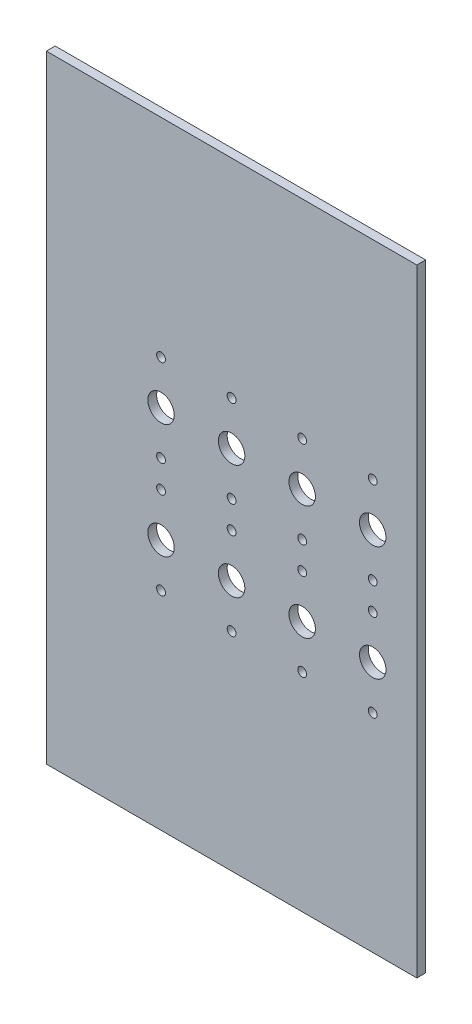
ISO-10303-21;
HEADER;
FILE_DESCRIPTION(('STEP AP214'),'2;1');
FILE_NAME('part.step','',(''),(''),'','','');
FILE_SCHEMA(('AUTOMOTIVE_DESIGN { 1 0 10303 214 1 1 1 1 }'));
ENDSEC;
DATA;
#1=APPLICATION_CONTEXT('core data for automotive mechanical design processes');
#2=APPLICATION_PROTOCOL_DEFINITION('international standard','automotive_design',2000,#1);
#3=PRODUCT_CONTEXT('',#1,'mechanical');
#4=PRODUCT('Part','Part','',(#3));
#5=PRODUCT_RELATED_PRODUCT_CATEGORY('part','',(#4));
#6=PRODUCT_DEFINITION_FORMATION('','',#4);
#7=PRODUCT_DEFINITION_CONTEXT('part definition',#1,'design');
#8=PRODUCT_DEFINITION('design','',#6,#7);
#9=PRODUCT_DEFINITION_SHAPE('','',#8);
#10=(LENGTH_UNIT() NAMED_UNIT(*) SI_UNIT(.MILLI.,.METRE.));
#11=(NAMED_UNIT(*) PLANE_ANGLE_UNIT() SI_UNIT($,.RADIAN.));
#12=(NAMED_UNIT(*) SI_UNIT($,.STERADIAN.) SOLID_ANGLE_UNIT());
#13=UNCERTAINTY_MEASURE_WITH_UNIT(LENGTH_MEASURE(1.E-05),#10,'distance_accuracy_value','');
#14=(GEOMETRIC_REPRESENTATION_CONTEXT(3) GLOBAL_UNCERTAINTY_ASSIGNED_CONTEXT((#13)) GLOBAL_UNIT_ASSIGNED_CONTEXT((#10,
#11,#12)) REPRESENTATION_CONTEXT('',''));
#15=CARTESIAN_POINT('',(0.,0.,0.));
#16=DIRECTION('',(0.,0.,1.));
#17=DIRECTION('',(1.,0.,0.));
#18=AXIS2_PLACEMENT_3D('',#15,#16,#17);
#19=CARTESIAN_POINT('',(0.,0.,10.));
#20=DIRECTION('',(0.,0.,1.));
#21=DIRECTION('',(1.,0.,0.));
#22=AXIS2_PLACEMENT_3D('',#19,#20,#21);
#23=PLANE('',#22);
#24=CARTESIAN_POINT('',(290.,-65.,10.));
#25=DIRECTION('',(0.,0.,1.));
#26=DIRECTION('',(1.,0.,0.));
#27=AXIS2_PLACEMENT_3D('',#24,#25,#26);
#28=CIRCLE('',#27,15.);
#29=CARTESIAN_POINT('',(305.,-65.,10.));
#30=VERTEX_POINT('',#29);
#31=EDGE_CURVE('E221',#30,#30,#28,.T.);
#32=ORIENTED_EDGE('',*,*,#31,.F.);
#33=EDGE_LOOP('',(#32));
#34=FACE_BOUND('',#33,.T.);
#35=CARTESIAN_POINT('',(130.,-65.,10.));
#36=DIRECTION('',(0.,0.,1.));
#37=DIRECTION('',(1.,0.,0.));
#38=AXIS2_PLACEMENT_3D('',#35,#36,#37);
#39=CIRCLE('',#38,15.);
#40=CARTESIAN_POINT('',(145.,-65.,10.));
#41=VERTEX_POINT('',#40);
#42=EDGE_CURVE('E215',#41,#41,#39,.T.);
#43=ORIENTED_EDGE('',*,*,#42,.F.);
#44=EDGE_LOOP('',(#43));
#45=FACE_BOUND('',#44,.T.);
#46=CARTESIAN_POINT('',(370.,-114.5,10.));
#47=DIRECTION('',(0.,0.,1.));
#48=DIRECTION('',(1.,0.,0.));
#49=AXIS2_PLACEMENT_3D('',#46,#47,#48);
#50=CIRCLE('',#49,4.99999999999989);
#51=CARTESIAN_POINT('',(375.,-114.5,10.));
#52=VERTEX_POINT('',#51);
#53=EDGE_CURVE('E199',#52,#52,#50,.T.);
#54=ORIENTED_EDGE('',*,*,#53,.F.);
#55=EDGE_LOOP('',(#54));
#56=FACE_BOUND('',#55,.T.);
#57=CARTESIAN_POINT('',(290.,-114.5,10.));
#58=DIRECTION('',(0.,0.,1.));
#59=DIRECTION('',(1.,0.,0.));
#60=AXIS2_PLACEMENT_3D('',#57,#58,#59);
#61=CIRCLE('',#60,4.99999999999989);
#62=CARTESIAN_POINT('',(295.,-114.5,10.));
#63=VERTEX_POINT('',#62);
#64=EDGE_CURVE('E187',#63,#63,#61,.T.);
#65=ORIENTED_EDGE('',*,*,#64,.F.);
#66=EDGE_LOOP('',(#65));
#67=FACE_BOUND('',#66,.T.);
#68=CARTESIAN_POINT('',(210.,-114.5,10.));
#69=DIRECTION('',(0.,0.,1.));
#70=DIRECTION('',(1.,0.,0.));
#71=AXIS2_PLACEMENT_3D('',#68,#69,#70);
#72=CIRCLE('',#71,4.99999999999989);
#73=CARTESIAN_POINT('',(215.,-114.5,10.));
#74=VERTEX_POINT('',#73);
#75=EDGE_CURVE('E176',#74,#74,#72,.T.);
#76=ORIENTED_EDGE('',*,*,#75,.F.);
#77=EDGE_LOOP('',(#76));
#78=FACE_BOUND('',#77,.T.);
#79=CARTESIAN_POINT('',(130.,-114.5,10.));
#80=DIRECTION('',(0.,0.,1.));
#81=DIRECTION('',(1.,0.,0.));
#82=AXIS2_PLACEMENT_3D('',#79,#80,#81);
#83=CIRCLE('',#82,4.99999999999989);
#84=CARTESIAN_POINT('',(135.,-114.5,10.));
#85=VERTEX_POINT('',#84);
#86=EDGE_CURVE('E163',#85,#85,#83,.T.);
#87=ORIENTED_EDGE('',*,*,#86,.F.);
#88=EDGE_LOOP('',(#87));
#89=FACE_BOUND('',#88,.T.);
#90=CARTESIAN_POINT('',(290.,65.,10.));
#91=DIRECTION('',(0.,0.,1.));
#92=DIRECTION('',(1.,0.,0.));
#93=AXIS2_PLACEMENT_3D('',#90,#91,#92);
#94=CIRCLE('',#93,15.);
#95=CARTESIAN_POINT('',(305.,65.,10.));
#96=VERTEX_POINT('',#95);
#97=EDGE_CURVE('E155',#96,#96,#94,.T.);
#98=ORIENTED_EDGE('',*,*,#97,.F.);
#99=EDGE_LOOP('',(#98));
#100=FACE_BOUND('',#99,.T.);
#101=CARTESIAN_POINT('',(130.,65.,10.));
#102=DIRECTION('',(0.,0.,1.));
#103=DIRECTION('',(1.,0.,0.));
#104=AXIS2_PLACEMENT_3D('',#101,#102,#103);
#105=CIRCLE('',#104,15.);
#106=CARTESIAN_POINT('',(145.,65.,10.));
#107=VERTEX_POINT('',#106);
#108=EDGE_CURVE('E139',#107,#107,#105,.T.);
#109=ORIENTED_EDGE('',*,*,#108,.F.);
#110=EDGE_LOOP('',(#109));
#111=FACE_BOUND('',#110,.T.);
#112=CARTESIAN_POINT('',(370.,114.5,10.));
#113=DIRECTION('',(0.,0.,1.));
#114=DIRECTION('',(1.,0.,0.));
#115=AXIS2_PLACEMENT_3D('',#112,#113,#114);
#116=CIRCLE('',#115,4.99999999999989);
#117=CARTESIAN_POINT('',(375.,114.5,10.));
#118=VERTEX_POINT('',#117);
#119=EDGE_CURVE('E128',#118,#118,#116,.T.);
#120=ORIENTED_EDGE('',*,*,#119,.F.);
#121=EDGE_LOOP('',(#120));
#122=FACE_BOUND('',#121,.T.);
#123=CARTESIAN_POINT('',(290.,114.5,10.));
#124=DIRECTION('',(0.,0.,1.));
#125=DIRECTION('',(1.,0.,0.));
#126=AXIS2_PLACEMENT_3D('',#123,#124,#125);
#127=CIRCLE('',#126,4.99999999999989);
#128=CARTESIAN_POINT('',(295.,114.5,10.));
#129=VERTEX_POINT('',#128);
#130=EDGE_CURVE('E116',#129,#129,#127,.T.);
#131=ORIENTED_EDGE('',*,*,#130,.F.);
#132=EDGE_LOOP('',(#131));
#133=FACE_BOUND('',#132,.T.);
#134=CARTESIAN_POINT('',(210.,114.5,10.));
#135=DIRECTION('',(0.,0.,1.));
#136=DIRECTION('',(1.,0.,0.));
#137=AXIS2_PLACEMENT_3D('',#134,#135,#136);
#138=CIRCLE('',#137,4.99999999999989);
#139=CARTESIAN_POINT('',(215.,114.5,10.));
#140=VERTEX_POINT('',#139);
#141=EDGE_CURVE('E102',#140,#140,#138,.T.);
#142=ORIENTED_EDGE('',*,*,#141,.F.);
#143=EDGE_LOOP('',(#142));
#144=FACE_BOUND('',#143,.T.);
#145=CARTESIAN_POINT('',(130.,114.5,10.));
#146=DIRECTION('',(0.,0.,1.));
#147=DIRECTION('',(1.,0.,0.));
#148=AXIS2_PLACEMENT_3D('',#145,#146,#147);
#149=CIRCLE('',#148,4.99999999999989);
#150=CARTESIAN_POINT('',(135.,114.5,10.));
#151=VERTEX_POINT('',#150);
#152=EDGE_CURVE('E83',#151,#151,#149,.T.);
#153=ORIENTED_EDGE('',*,*,#152,.F.);
#154=EDGE_LOOP('',(#153));
#155=FACE_BOUND('',#154,.T.);
#156=DIRECTION('',(0.,-1.,0.));
#157=VECTOR('',#156,1.);
#158=CARTESIAN_POINT('',(0.,350.,10.));
#159=LINE('',#158,#157);
#160=CARTESIAN_POINT('',(0.,350.,10.));
#161=VERTEX_POINT('',#160);
#162=CARTESIAN_POINT('',(0.,-350.,10.));
#163=VERTEX_POINT('',#162);
#164=EDGE_CURVE('E68',#161,#163,#159,.T.);
#165=ORIENTED_EDGE('',*,*,#164,.T.);
#166=DIRECTION('',(1.,0.,0.));
#167=VECTOR('',#166,1.);
#168=CARTESIAN_POINT('',(0.,-350.,10.));
#169=LINE('',#168,#167);
#170=CARTESIAN_POINT('',(420.,-350.,10.));
#171=VERTEX_POINT('',#170);
#172=EDGE_CURVE('E64',#163,#171,#169,.T.);
#173=ORIENTED_EDGE('',*,*,#172,.T.);
#174=DIRECTION('',(0.,1.,0.));
#175=VECTOR('',#174,1.);
#176=CARTESIAN_POINT('',(420.,-350.,10.));
#177=LINE('',#176,#175);
#178=CARTESIAN_POINT('',(420.,350.,10.));
#179=VERTEX_POINT('',#178);
#180=EDGE_CURVE('E66',#171,#179,#177,.T.);
#181=ORIENTED_EDGE('',*,*,#180,.T.);
#182=DIRECTION('',(-1.,0.,0.));
#183=VECTOR('',#182,1.);
#184=CARTESIAN_POINT('',(420.,350.,10.));
#185=LINE('',#184,#183);
#186=EDGE_CURVE('E31',#179,#161,#185,.T.);
#187=ORIENTED_EDGE('',*,*,#186,.T.);
#188=EDGE_LOOP('',(#165,#173,#181,#187));
#189=FACE_BOUND('',#188,.T.);
#190=CARTESIAN_POINT('',(130.,15.5,10.));
#191=DIRECTION('',(0.,0.,1.));
#192=DIRECTION('',(1.,0.,0.));
#193=AXIS2_PLACEMENT_3D('',#190,#191,#192);
#194=CIRCLE('',#193,4.99999999999989);
#195=CARTESIAN_POINT('',(135.,15.5,10.));
#196=VERTEX_POINT('',#195);
#197=EDGE_CURVE('E98',#196,#196,#194,.T.);
#198=ORIENTED_EDGE('',*,*,#197,.F.);
#199=EDGE_LOOP('',(#198));
#200=FACE_BOUND('',#199,.T.);
#201=CARTESIAN_POINT('',(210.,15.5,10.));
#202=DIRECTION('',(0.,0.,1.));
#203=DIRECTION('',(1.,0.,0.));
#204=AXIS2_PLACEMENT_3D('',#201,#202,#203);
#205=CIRCLE('',#204,4.99999999999989);
#206=CARTESIAN_POINT('',(215.,15.5,10.));
#207=VERTEX_POINT('',#206);
#208=EDGE_CURVE('E109',#207,#207,#205,.T.);
#209=ORIENTED_EDGE('',*,*,#208,.F.);
#210=EDGE_LOOP('',(#209));
#211=FACE_BOUND('',#210,.T.);
#212=CARTESIAN_POINT('',(290.,15.5,10.));
#213=DIRECTION('',(0.,0.,1.));
#214=DIRECTION('',(1.,0.,0.));
#215=AXIS2_PLACEMENT_3D('',#212,#213,#214);
#216=CIRCLE('',#215,4.99999999999989);
#217=CARTESIAN_POINT('',(295.,15.5,10.));
#218=VERTEX_POINT('',#217);
#219=EDGE_CURVE('E125',#218,#218,#216,.T.);
#220=ORIENTED_EDGE('',*,*,#219,.F.);
#221=EDGE_LOOP('',(#220));
#222=FACE_BOUND('',#221,.T.);
#223=CARTESIAN_POINT('',(370.,15.5,10.));
#224=DIRECTION('',(0.,0.,1.));
#225=DIRECTION('',(1.,0.,0.));
#226=AXIS2_PLACEMENT_3D('',#223,#224,#225);
#227=CIRCLE('',#226,4.99999999999989);
#228=CARTESIAN_POINT('',(375.,15.5,10.));
#229=VERTEX_POINT('',#228);
#230=EDGE_CURVE('E133',#229,#229,#227,.T.);
#231=ORIENTED_EDGE('',*,*,#230,.F.);
#232=EDGE_LOOP('',(#231));
#233=FACE_BOUND('',#232,.T.);
#234=CARTESIAN_POINT('',(210.,65.,10.));
#235=DIRECTION('',(0.,0.,1.));
#236=DIRECTION('',(1.,0.,0.));
#237=AXIS2_PLACEMENT_3D('',#234,#235,#236);
#238=CIRCLE('',#237,15.);
#239=CARTESIAN_POINT('',(225.,65.,10.));
#240=VERTEX_POINT('',#239);
#241=EDGE_CURVE('E148',#240,#240,#238,.T.);
#242=ORIENTED_EDGE('',*,*,#241,.F.);
#243=EDGE_LOOP('',(#242));
#244=FACE_BOUND('',#243,.T.);
#245=CARTESIAN_POINT('',(370.,65.,10.));
#246=DIRECTION('',(0.,0.,1.));
#247=DIRECTION('',(1.,0.,0.));
#248=AXIS2_PLACEMENT_3D('',#245,#246,#247);
#249=CIRCLE('',#248,15.);
#250=CARTESIAN_POINT('',(385.,65.,10.));
#251=VERTEX_POINT('',#250);
#252=EDGE_CURVE('E158',#251,#251,#249,.T.);
#253=ORIENTED_EDGE('',*,*,#252,.F.);
#254=EDGE_LOOP('',(#253));
#255=FACE_BOUND('',#254,.T.);
#256=CARTESIAN_POINT('',(130.,-15.5,10.));
#257=DIRECTION('',(0.,0.,1.));
#258=DIRECTION('',(1.,0.,0.));
#259=AXIS2_PLACEMENT_3D('',#256,#257,#258);
#260=CIRCLE('',#259,4.99999999999989);
#261=CARTESIAN_POINT('',(135.,-15.5,10.));
#262=VERTEX_POINT('',#261);
#263=EDGE_CURVE('E168',#262,#262,#260,.T.);
#264=ORIENTED_EDGE('',*,*,#263,.F.);
#265=EDGE_LOOP('',(#264));
#266=FACE_BOUND('',#265,.T.);
#267=CARTESIAN_POINT('',(210.,-15.5,10.));
#268=DIRECTION('',(0.,0.,1.));
#269=DIRECTION('',(1.,0.,0.));
#270=AXIS2_PLACEMENT_3D('',#267,#268,#269);
#271=CIRCLE('',#270,4.99999999999989);
#272=CARTESIAN_POINT('',(215.,-15.5,10.));
#273=VERTEX_POINT('',#272);
#274=EDGE_CURVE('E181',#273,#273,#271,.T.);
#275=ORIENTED_EDGE('',*,*,#274,.F.);
#276=EDGE_LOOP('',(#275));
#277=FACE_BOUND('',#276,.T.);
#278=CARTESIAN_POINT('',(290.,-15.5,10.));
#279=DIRECTION('',(0.,0.,1.));
#280=DIRECTION('',(1.,0.,0.));
#281=AXIS2_PLACEMENT_3D('',#278,#279,#280);
#282=CIRCLE('',#281,4.99999999999989);
#283=CARTESIAN_POINT('',(295.,-15.5,10.));
#284=VERTEX_POINT('',#283);
#285=EDGE_CURVE('E192',#284,#284,#282,.T.);
#286=ORIENTED_EDGE('',*,*,#285,.F.);
#287=EDGE_LOOP('',(#286));
#288=FACE_BOUND('',#287,.T.);
#289=CARTESIAN_POINT('',(370.,-15.5,10.));
#290=DIRECTION('',(0.,0.,1.));
#291=DIRECTION('',(1.,0.,0.));
#292=AXIS2_PLACEMENT_3D('',#289,#290,#291);
#293=CIRCLE('',#292,4.99999999999989);
#294=CARTESIAN_POINT('',(375.,-15.5,10.));
#295=VERTEX_POINT('',#294);
#296=EDGE_CURVE('E206',#295,#295,#293,.T.);
#297=ORIENTED_EDGE('',*,*,#296,.F.);
#298=EDGE_LOOP('',(#297));
#299=FACE_BOUND('',#298,.T.);
#300=CARTESIAN_POINT('',(210.,-65.,10.));
#301=DIRECTION('',(0.,0.,1.));
#302=DIRECTION('',(1.,0.,0.));
#303=AXIS2_PLACEMENT_3D('',#300,#301,#302);
#304=CIRCLE('',#303,15.);
#305=CARTESIAN_POINT('',(225.,-65.,10.));
#306=VERTEX_POINT('',#305);
#307=EDGE_CURVE('E217',#306,#306,#304,.T.);
#308=ORIENTED_EDGE('',*,*,#307,.F.);
#309=EDGE_LOOP('',(#308));
#310=FACE_BOUND('',#309,.T.);
#311=CARTESIAN_POINT('',(370.,-65.,10.));
#312=DIRECTION('',(0.,0.,1.));
#313=DIRECTION('',(1.,0.,0.));
#314=AXIS2_PLACEMENT_3D('',#311,#312,#313);
#315=CIRCLE('',#314,15.);
#316=CARTESIAN_POINT('',(385.,-65.,10.));
#317=VERTEX_POINT('',#316);
#318=EDGE_CURVE('E230',#317,#317,#315,.T.);
#319=ORIENTED_EDGE('',*,*,#318,.F.);
#320=EDGE_LOOP('',(#319));
#321=FACE_BOUND('',#320,.T.);
#322=ADVANCED_FACE('F16',(#34,#45,#56,#67,#78,#89,#100,#111,#122,#133,#144,#155,#189,#200,#211,
#222,#233,#244,#255,#266,#277,#288,#299,#310,#321),#23,.T.);
#323=CARTESIAN_POINT('',(0.,0.,0.));
#324=DIRECTION('',(0.,0.,1.));
#325=DIRECTION('',(1.,0.,0.));
#326=AXIS2_PLACEMENT_3D('',#323,#324,#325);
#327=PLANE('',#326);
#328=CARTESIAN_POINT('',(290.,-65.,0.));
#329=DIRECTION('',(0.,0.,1.));
#330=DIRECTION('',(1.,0.,0.));
#331=AXIS2_PLACEMENT_3D('',#328,#329,#330);
#332=CIRCLE('',#331,15.);
#333=CARTESIAN_POINT('',(305.,-65.,0.));
#334=VERTEX_POINT('',#333);
#335=EDGE_CURVE('E227',#334,#334,#332,.T.);
#336=ORIENTED_EDGE('',*,*,#335,.T.);
#337=EDGE_LOOP('',(#336));
#338=FACE_BOUND('',#337,.T.);
#339=CARTESIAN_POINT('',(130.,-65.,0.));
#340=DIRECTION('',(0.,0.,1.));
#341=DIRECTION('',(1.,0.,0.));
#342=AXIS2_PLACEMENT_3D('',#339,#340,#341);
#343=CIRCLE('',#342,15.);
#344=CARTESIAN_POINT('',(145.,-65.,0.));
#345=VERTEX_POINT('',#344);
#346=EDGE_CURVE('E214',#345,#345,#343,.T.);
#347=ORIENTED_EDGE('',*,*,#346,.T.);
#348=EDGE_LOOP('',(#347));
#349=FACE_BOUND('',#348,.T.);
#350=CARTESIAN_POINT('',(370.,-114.5,0.));
#351=DIRECTION('',(0.,0.,1.));
#352=DIRECTION('',(1.,0.,0.));
#353=AXIS2_PLACEMENT_3D('',#350,#351,#352);
#354=CIRCLE('',#353,4.99999999999989);
#355=CARTESIAN_POINT('',(375.,-114.5,0.));
#356=VERTEX_POINT('',#355);
#357=EDGE_CURVE('E201',#356,#356,#354,.T.);
#358=ORIENTED_EDGE('',*,*,#357,.T.);
#359=EDGE_LOOP('',(#358));
#360=FACE_BOUND('',#359,.T.);
#361=CARTESIAN_POINT('',(290.,-114.5,0.));
#362=DIRECTION('',(0.,0.,1.));
#363=DIRECTION('',(1.,0.,0.));
#364=AXIS2_PLACEMENT_3D('',#361,#362,#363);
#365=CIRCLE('',#364,4.99999999999989);
#366=CARTESIAN_POINT('',(295.,-114.5,0.));
#367=VERTEX_POINT('',#366);
#368=EDGE_CURVE('E191',#367,#367,#365,.T.);
#369=ORIENTED_EDGE('',*,*,#368,.T.);
#370=EDGE_LOOP('',(#369));
#371=FACE_BOUND('',#370,.T.);
#372=CARTESIAN_POINT('',(210.,-114.5,0.));
#373=DIRECTION('',(0.,0.,1.));
#374=DIRECTION('',(1.,0.,0.));
#375=AXIS2_PLACEMENT_3D('',#372,#373,#374);
#376=CIRCLE('',#375,4.99999999999989);
#377=CARTESIAN_POINT('',(215.,-114.5,0.));
#378=VERTEX_POINT('',#377);
#379=EDGE_CURVE('E177',#378,#378,#376,.T.);
#380=ORIENTED_EDGE('',*,*,#379,.T.);
#381=EDGE_LOOP('',(#380));
#382=FACE_BOUND('',#381,.T.);
#383=CARTESIAN_POINT('',(130.,-114.5,0.));
#384=DIRECTION('',(0.,0.,1.));
#385=DIRECTION('',(1.,0.,0.));
#386=AXIS2_PLACEMENT_3D('',#383,#384,#385);
#387=CIRCLE('',#386,4.99999999999989);
#388=CARTESIAN_POINT('',(135.,-114.5,0.));
#389=VERTEX_POINT('',#388);
#390=EDGE_CURVE('E170',#389,#389,#387,.T.);
#391=ORIENTED_EDGE('',*,*,#390,.T.);
#392=EDGE_LOOP('',(#391));
#393=FACE_BOUND('',#392,.T.);
#394=CARTESIAN_POINT('',(290.,65.,0.));
#395=DIRECTION('',(0.,0.,1.));
#396=DIRECTION('',(1.,0.,0.));
#397=AXIS2_PLACEMENT_3D('',#394,#395,#396);
#398=CIRCLE('',#397,15.);
#399=CARTESIAN_POINT('',(305.,65.,0.));
#400=VERTEX_POINT('',#399);
#401=EDGE_CURVE('E154',#400,#400,#398,.T.);
#402=ORIENTED_EDGE('',*,*,#401,.T.);
#403=EDGE_LOOP('',(#402));
#404=FACE_BOUND('',#403,.T.);
#405=CARTESIAN_POINT('',(130.,65.,0.));
#406=DIRECTION('',(0.,0.,1.));
#407=DIRECTION('',(1.,0.,0.));
#408=AXIS2_PLACEMENT_3D('',#405,#406,#407);
#409=CIRCLE('',#408,15.);
#410=CARTESIAN_POINT('',(145.,65.,0.));
#411=VERTEX_POINT('',#410);
#412=EDGE_CURVE('E141',#411,#411,#409,.T.);
#413=ORIENTED_EDGE('',*,*,#412,.T.);
#414=EDGE_LOOP('',(#413));
#415=FACE_BOUND('',#414,.T.);
#416=CARTESIAN_POINT('',(370.,114.5,0.));
#417=DIRECTION('',(0.,0.,1.));
#418=DIRECTION('',(1.,0.,0.));
#419=AXIS2_PLACEMENT_3D('',#416,#417,#418);
#420=CIRCLE('',#419,4.99999999999989);
#421=CARTESIAN_POINT('',(375.,114.5,0.));
#422=VERTEX_POINT('',#421);
#423=EDGE_CURVE('E131',#422,#422,#420,.T.);
#424=ORIENTED_EDGE('',*,*,#423,.T.);
#425=EDGE_LOOP('',(#424));
#426=FACE_BOUND('',#425,.T.);
#427=CARTESIAN_POINT('',(290.,114.5,0.));
#428=DIRECTION('',(0.,0.,1.));
#429=DIRECTION('',(1.,0.,0.));
#430=AXIS2_PLACEMENT_3D('',#427,#428,#429);
#431=CIRCLE('',#430,4.99999999999989);
#432=CARTESIAN_POINT('',(295.,114.5,0.));
#433=VERTEX_POINT('',#432);
#434=EDGE_CURVE('E118',#433,#433,#431,.T.);
#435=ORIENTED_EDGE('',*,*,#434,.T.);
#436=EDGE_LOOP('',(#435));
#437=FACE_BOUND('',#436,.T.);
#438=CARTESIAN_POINT('',(210.,114.5,0.));
#439=DIRECTION('',(0.,0.,1.));
#440=DIRECTION('',(1.,0.,0.));
#441=AXIS2_PLACEMENT_3D('',#438,#439,#440);
#442=CIRCLE('',#441,4.99999999999989);
#443=CARTESIAN_POINT('',(215.,114.5,0.));
#444=VERTEX_POINT('',#443);
#445=EDGE_CURVE('E110',#444,#444,#442,.T.);
#446=ORIENTED_EDGE('',*,*,#445,.T.);
#447=EDGE_LOOP('',(#446));
#448=FACE_BOUND('',#447,.T.);
#449=CARTESIAN_POINT('',(130.,114.5,0.));
#450=DIRECTION('',(0.,0.,1.));
#451=DIRECTION('',(1.,0.,0.));
#452=AXIS2_PLACEMENT_3D('',#449,#450,#451);
#453=CIRCLE('',#452,4.99999999999989);
#454=CARTESIAN_POINT('',(135.,114.5,0.));
#455=VERTEX_POINT('',#454);
#456=EDGE_CURVE('E92',#455,#455,#453,.T.);
#457=ORIENTED_EDGE('',*,*,#456,.T.);
#458=EDGE_LOOP('',(#457));
#459=FACE_BOUND('',#458,.T.);
#460=DIRECTION('',(0.,-1.,0.));
#461=VECTOR('',#460,1.);
#462=CARTESIAN_POINT('',(0.,350.,0.));
#463=LINE('',#462,#461);
#464=CARTESIAN_POINT('',(0.,350.,0.));
#465=VERTEX_POINT('',#464);
#466=CARTESIAN_POINT('',(0.,-350.,0.));
#467=VERTEX_POINT('',#466);
#468=EDGE_CURVE('E79',#465,#467,#463,.T.);
#469=ORIENTED_EDGE('',*,*,#468,.F.);
#470=DIRECTION('',(-1.,0.,0.));
#471=VECTOR('',#470,1.);
#472=CARTESIAN_POINT('',(420.,350.,0.));
#473=LINE('',#472,#471);
#474=CARTESIAN_POINT('',(420.,350.,0.));
#475=VERTEX_POINT('',#474);
#476=EDGE_CURVE('E57',#475,#465,#473,.T.);
#477=ORIENTED_EDGE('',*,*,#476,.F.);
#478=DIRECTION('',(0.,1.,0.));
#479=VECTOR('',#478,1.);
#480=CARTESIAN_POINT('',(420.,-350.,0.));
#481=LINE('',#480,#479);
#482=CARTESIAN_POINT('',(420.,-350.,0.));
#483=VERTEX_POINT('',#482);
#484=EDGE_CURVE('E49',#483,#475,#481,.T.);
#485=ORIENTED_EDGE('',*,*,#484,.F.);
#486=DIRECTION('',(1.,0.,0.));
#487=VECTOR('',#486,1.);
#488=CARTESIAN_POINT('',(0.,-350.,0.));
#489=LINE('',#488,#487);
#490=EDGE_CURVE('E71',#467,#483,#489,.T.);
#491=ORIENTED_EDGE('',*,*,#490,.F.);
#492=EDGE_LOOP('',(#469,#477,#485,#491));
#493=FACE_BOUND('',#492,.T.);
#494=CARTESIAN_POINT('',(130.,15.5,0.));
#495=DIRECTION('',(0.,0.,1.));
#496=DIRECTION('',(1.,0.,0.));
#497=AXIS2_PLACEMENT_3D('',#494,#495,#496);
#498=CIRCLE('',#497,4.99999999999989);
#499=CARTESIAN_POINT('',(135.,15.5,0.));
#500=VERTEX_POINT('',#499);
#501=EDGE_CURVE('E101',#500,#500,#498,.T.);
#502=ORIENTED_EDGE('',*,*,#501,.T.);
#503=EDGE_LOOP('',(#502));
#504=FACE_BOUND('',#503,.T.);
#505=CARTESIAN_POINT('',(210.,15.5,0.));
#506=DIRECTION('',(0.,0.,1.));
#507=DIRECTION('',(1.,0.,0.));
#508=AXIS2_PLACEMENT_3D('',#505,#506,#507);
#509=CIRCLE('',#508,4.99999999999989);
#510=CARTESIAN_POINT('',(215.,15.5,0.));
#511=VERTEX_POINT('',#510);
#512=EDGE_CURVE('E114',#511,#511,#509,.T.);
#513=ORIENTED_EDGE('',*,*,#512,.T.);
#514=EDGE_LOOP('',(#513));
#515=FACE_BOUND('',#514,.T.);
#516=CARTESIAN_POINT('',(290.,15.5,0.));
#517=DIRECTION('',(0.,0.,1.));
#518=DIRECTION('',(1.,0.,0.));
#519=AXIS2_PLACEMENT_3D('',#516,#517,#518);
#520=CIRCLE('',#519,4.99999999999989);
#521=CARTESIAN_POINT('',(295.,15.5,0.));
#522=VERTEX_POINT('',#521);
#523=EDGE_CURVE('E124',#522,#522,#520,.T.);
#524=ORIENTED_EDGE('',*,*,#523,.T.);
#525=EDGE_LOOP('',(#524));
#526=FACE_BOUND('',#525,.T.);
#527=CARTESIAN_POINT('',(370.,15.5,0.));
#528=DIRECTION('',(0.,0.,1.));
#529=DIRECTION('',(1.,0.,0.));
#530=AXIS2_PLACEMENT_3D('',#527,#528,#529);
#531=CIRCLE('',#530,4.99999999999989);
#532=CARTESIAN_POINT('',(375.,15.5,0.));
#533=VERTEX_POINT('',#532);
#534=EDGE_CURVE('E140',#533,#533,#531,.T.);
#535=ORIENTED_EDGE('',*,*,#534,.T.);
#536=EDGE_LOOP('',(#535));
#537=FACE_BOUND('',#536,.T.);
#538=CARTESIAN_POINT('',(210.,65.,0.));
#539=DIRECTION('',(0.,0.,1.));
#540=DIRECTION('',(1.,0.,0.));
#541=AXIS2_PLACEMENT_3D('',#538,#539,#540);
#542=CIRCLE('',#541,15.);
#543=CARTESIAN_POINT('',(225.,65.,0.));
#544=VERTEX_POINT('',#543);
#545=EDGE_CURVE('E149',#544,#544,#542,.T.);
#546=ORIENTED_EDGE('',*,*,#545,.T.);
#547=EDGE_LOOP('',(#546));
#548=FACE_BOUND('',#547,.T.);
#549=CARTESIAN_POINT('',(370.,65.,0.));
#550=DIRECTION('',(0.,0.,1.));
#551=DIRECTION('',(1.,0.,0.));
#552=AXIS2_PLACEMENT_3D('',#549,#550,#551);
#553=CIRCLE('',#552,15.);
#554=CARTESIAN_POINT('',(385.,65.,0.));
#555=VERTEX_POINT('',#554);
#556=EDGE_CURVE('E161',#555,#555,#553,.T.);
#557=ORIENTED_EDGE('',*,*,#556,.T.);
#558=EDGE_LOOP('',(#557));
#559=FACE_BOUND('',#558,.T.);
#560=CARTESIAN_POINT('',(130.,-15.5,0.));
#561=DIRECTION('',(0.,0.,1.));
#562=DIRECTION('',(1.,0.,0.));
#563=AXIS2_PLACEMENT_3D('',#560,#561,#562);
#564=CIRCLE('',#563,4.99999999999989);
#565=CARTESIAN_POINT('',(135.,-15.5,0.));
#566=VERTEX_POINT('',#565);
#567=EDGE_CURVE('E174',#566,#566,#564,.T.);
#568=ORIENTED_EDGE('',*,*,#567,.T.);
#569=EDGE_LOOP('',(#568));
#570=FACE_BOUND('',#569,.T.);
#571=CARTESIAN_POINT('',(210.,-15.5,0.));
#572=DIRECTION('',(0.,0.,1.));
#573=DIRECTION('',(1.,0.,0.));
#574=AXIS2_PLACEMENT_3D('',#571,#572,#573);
#575=CIRCLE('',#574,4.99999999999989);
#576=CARTESIAN_POINT('',(215.,-15.5,0.));
#577=VERTEX_POINT('',#576);
#578=EDGE_CURVE('E184',#577,#577,#575,.T.);
#579=ORIENTED_EDGE('',*,*,#578,.T.);
#580=EDGE_LOOP('',(#579));
#581=FACE_BOUND('',#580,.T.);
#582=CARTESIAN_POINT('',(290.,-15.5,0.));
#583=DIRECTION('',(0.,0.,1.));
#584=DIRECTION('',(1.,0.,0.));
#585=AXIS2_PLACEMENT_3D('',#582,#583,#584);
#586=CIRCLE('',#585,4.99999999999989);
#587=CARTESIAN_POINT('',(295.,-15.5,0.));
#588=VERTEX_POINT('',#587);
#589=EDGE_CURVE('E197',#588,#588,#586,.T.);
#590=ORIENTED_EDGE('',*,*,#589,.T.);
#591=EDGE_LOOP('',(#590));
#592=FACE_BOUND('',#591,.T.);
#593=CARTESIAN_POINT('',(370.,-15.5,0.));
#594=DIRECTION('',(0.,0.,1.));
#595=DIRECTION('',(1.,0.,0.));
#596=AXIS2_PLACEMENT_3D('',#593,#594,#595);
#597=CIRCLE('',#596,4.99999999999989);
#598=CARTESIAN_POINT('',(375.,-15.5,0.));
#599=VERTEX_POINT('',#598);
#600=EDGE_CURVE('E207',#599,#599,#597,.T.);
#601=ORIENTED_EDGE('',*,*,#600,.T.);
#602=EDGE_LOOP('',(#601));
#603=FACE_BOUND('',#602,.T.);
#604=CARTESIAN_POINT('',(210.,-65.,0.));
#605=DIRECTION('',(0.,0.,1.));
#606=DIRECTION('',(1.,0.,0.));
#607=AXIS2_PLACEMENT_3D('',#604,#605,#606);
#608=CIRCLE('',#607,15.);
#609=CARTESIAN_POINT('',(225.,-65.,0.));
#610=VERTEX_POINT('',#609);
#611=EDGE_CURVE('E222',#610,#610,#608,.T.);
#612=ORIENTED_EDGE('',*,*,#611,.T.);
#613=EDGE_LOOP('',(#612));
#614=FACE_BOUND('',#613,.T.);
#615=CARTESIAN_POINT('',(370.,-65.,0.));
#616=DIRECTION('',(0.,0.,1.));
#617=DIRECTION('',(1.,0.,0.));
#618=AXIS2_PLACEMENT_3D('',#615,#616,#617);
#619=CIRCLE('',#618,15.);
#620=CARTESIAN_POINT('',(385.,-65.,0.));
#621=VERTEX_POINT('',#620);
#622=EDGE_CURVE('E233',#621,#621,#619,.T.);
#623=ORIENTED_EDGE('',*,*,#622,.T.);
#624=EDGE_LOOP('',(#623));
#625=FACE_BOUND('',#624,.T.);
#626=ADVANCED_FACE('F93',(#338,#349,#360,#371,#382,#393,#404,#415,#426,#437,#448,#459,#493,#504,
#515,#526,#537,#548,#559,#570,#581,#592,#603,#614,#625),#327,.F.);
#627=CARTESIAN_POINT('',(0.,350.,10.));
#628=DIRECTION('',(1.,0.,0.));
#629=DIRECTION('',(0.,0.,-1.));
#630=AXIS2_PLACEMENT_3D('',#627,#628,#629);
#631=PLANE('',#630);
#632=ORIENTED_EDGE('',*,*,#468,.T.);
#633=DIRECTION('',(0.,0.,-1.));
#634=VECTOR('',#633,1.);
#635=CARTESIAN_POINT('',(0.,-350.,10.));
#636=LINE('',#635,#634);
#637=EDGE_CURVE('E11',#163,#467,#636,.T.);
#638=ORIENTED_EDGE('',*,*,#637,.F.);
#639=ORIENTED_EDGE('',*,*,#164,.F.);
#640=DIRECTION('',(0.,0.,-1.));
#641=VECTOR('',#640,1.);
#642=CARTESIAN_POINT('',(0.,350.,10.));
#643=LINE('',#642,#641);
#644=EDGE_CURVE('E76',#161,#465,#643,.T.);
#645=ORIENTED_EDGE('',*,*,#644,.T.);
#646=EDGE_LOOP('',(#632,#638,#639,#645));
#647=FACE_BOUND('',#646,.T.);
#648=ADVANCED_FACE('F18',(#647),#631,.F.);
#649=CARTESIAN_POINT('',(0.,-350.,10.));
#650=DIRECTION('',(0.,1.,0.));
#651=DIRECTION('',(0.,0.,1.));
#652=AXIS2_PLACEMENT_3D('',#649,#650,#651);
#653=PLANE('',#652);
#654=ORIENTED_EDGE('',*,*,#490,.T.);
#655=DIRECTION('',(0.,0.,-1.));
#656=VECTOR('',#655,1.);
#657=CARTESIAN_POINT('',(420.,-350.,10.));
#658=LINE('',#657,#656);
#659=EDGE_CURVE('E25',#171,#483,#658,.T.);
#660=ORIENTED_EDGE('',*,*,#659,.F.);
#661=ORIENTED_EDGE('',*,*,#172,.F.);
#662=ORIENTED_EDGE('',*,*,#637,.T.);
#663=EDGE_LOOP('',(#654,#660,#661,#662));
#664=FACE_BOUND('',#663,.T.);
#665=ADVANCED_FACE('F75',(#664),#653,.F.);
#666=CARTESIAN_POINT('',(420.,-350.,10.));
#667=DIRECTION('',(-1.,0.,0.));
#668=DIRECTION('',(0.,0.,1.));
#669=AXIS2_PLACEMENT_3D('',#666,#667,#668);
#670=PLANE('',#669);
#671=ORIENTED_EDGE('',*,*,#484,.T.);
#672=DIRECTION('',(0.,0.,-1.));
#673=VECTOR('',#672,1.);
#674=CARTESIAN_POINT('',(420.,350.,10.));
#675=LINE('',#674,#673);
#676=EDGE_CURVE('E73',#179,#475,#675,.T.);
#677=ORIENTED_EDGE('',*,*,#676,.F.);
#678=ORIENTED_EDGE('',*,*,#180,.F.);
#679=ORIENTED_EDGE('',*,*,#659,.T.);
#680=EDGE_LOOP('',(#671,#677,#678,#679));
#681=FACE_BOUND('',#680,.T.);
#682=ADVANCED_FACE('F72',(#681),#670,.F.);
#683=CARTESIAN_POINT('',(420.,350.,10.));
#684=DIRECTION('',(0.,-1.,0.));
#685=DIRECTION('',(0.,0.,-1.));
#686=AXIS2_PLACEMENT_3D('',#683,#684,#685);
#687=PLANE('',#686);
#688=ORIENTED_EDGE('',*,*,#476,.T.);
#689=ORIENTED_EDGE('',*,*,#644,.F.);
#690=ORIENTED_EDGE('',*,*,#186,.F.);
#691=ORIENTED_EDGE('',*,*,#676,.T.);
#692=EDGE_LOOP('',(#688,#689,#690,#691));
#693=FACE_BOUND('',#692,.T.);
#694=ADVANCED_FACE('F86',(#693),#687,.F.);
#695=CARTESIAN_POINT('',(130.,114.5,10.));
#696=DIRECTION('',(0.,0.,-1.));
#697=DIRECTION('',(-1.,0.,0.));
#698=AXIS2_PLACEMENT_3D('',#695,#696,#697);
#699=CYLINDRICAL_SURFACE('',#698,4.99999999999989);
#700=ORIENTED_EDGE('',*,*,#152,.T.);
#701=EDGE_LOOP('',(#700));
#702=FACE_BOUND('',#701,.T.);
#703=ORIENTED_EDGE('',*,*,#456,.F.);
#704=EDGE_LOOP('',(#703));
#705=FACE_BOUND('',#704,.T.);
#706=ADVANCED_FACE('F254',(#702,#705),#699,.F.);
#707=CARTESIAN_POINT('',(130.,15.5,10.));
#708=DIRECTION('',(0.,0.,-1.));
#709=DIRECTION('',(-1.,0.,0.));
#710=AXIS2_PLACEMENT_3D('',#707,#708,#709);
#711=CYLINDRICAL_SURFACE('',#710,4.99999999999989);
#712=ORIENTED_EDGE('',*,*,#197,.T.);
#713=EDGE_LOOP('',(#712));
#714=FACE_BOUND('',#713,.T.);
#715=ORIENTED_EDGE('',*,*,#501,.F.);
#716=EDGE_LOOP('',(#715));
#717=FACE_BOUND('',#716,.T.);
#718=ADVANCED_FACE('F292',(#714,#717),#711,.F.);
#719=CARTESIAN_POINT('',(210.,114.5,10.));
#720=DIRECTION('',(0.,0.,-1.));
#721=DIRECTION('',(-1.,0.,0.));
#722=AXIS2_PLACEMENT_3D('',#719,#720,#721);
#723=CYLINDRICAL_SURFACE('',#722,4.99999999999989);
#724=ORIENTED_EDGE('',*,*,#141,.T.);
#725=EDGE_LOOP('',(#724));
#726=FACE_BOUND('',#725,.T.);
#727=ORIENTED_EDGE('',*,*,#445,.F.);
#728=EDGE_LOOP('',(#727));
#729=FACE_BOUND('',#728,.T.);
#730=ADVANCED_FACE('F301',(#726,#729),#723,.F.);
#731=CARTESIAN_POINT('',(210.,15.5,10.));
#732=DIRECTION('',(0.,0.,-1.));
#733=DIRECTION('',(-1.,0.,0.));
#734=AXIS2_PLACEMENT_3D('',#731,#732,#733);
#735=CYLINDRICAL_SURFACE('',#734,4.99999999999989);
#736=ORIENTED_EDGE('',*,*,#208,.T.);
#737=EDGE_LOOP('',(#736));
#738=FACE_BOUND('',#737,.T.);
#739=ORIENTED_EDGE('',*,*,#512,.F.);
#740=EDGE_LOOP('',(#739));
#741=FACE_BOUND('',#740,.T.);
#742=ADVANCED_FACE('F306',(#738,#741),#735,.F.);
#743=CARTESIAN_POINT('',(290.,114.5,10.));
#744=DIRECTION('',(0.,0.,-1.));
#745=DIRECTION('',(-1.,0.,0.));
#746=AXIS2_PLACEMENT_3D('',#743,#744,#745);
#747=CYLINDRICAL_SURFACE('',#746,4.99999999999989);
#748=ORIENTED_EDGE('',*,*,#130,.T.);
#749=EDGE_LOOP('',(#748));
#750=FACE_BOUND('',#749,.T.);
#751=ORIENTED_EDGE('',*,*,#434,.F.);
#752=EDGE_LOOP('',(#751));
#753=FACE_BOUND('',#752,.T.);
#754=ADVANCED_FACE('F316',(#750,#753),#747,.F.);
#755=CARTESIAN_POINT('',(290.,15.5,10.));
#756=DIRECTION('',(0.,0.,-1.));
#757=DIRECTION('',(-1.,0.,0.));
#758=AXIS2_PLACEMENT_3D('',#755,#756,#757);
#759=CYLINDRICAL_SURFACE('',#758,4.99999999999989);
#760=ORIENTED_EDGE('',*,*,#219,.T.);
#761=EDGE_LOOP('',(#760));
#762=FACE_BOUND('',#761,.T.);
#763=ORIENTED_EDGE('',*,*,#523,.F.);
#764=EDGE_LOOP('',(#763));
#765=FACE_BOUND('',#764,.T.);
#766=ADVANCED_FACE('F322',(#762,#765),#759,.F.);
#767=CARTESIAN_POINT('',(370.,114.5,10.));
#768=DIRECTION('',(0.,0.,-1.));
#769=DIRECTION('',(-1.,0.,0.));
#770=AXIS2_PLACEMENT_3D('',#767,#768,#769);
#771=CYLINDRICAL_SURFACE('',#770,4.99999999999989);
#772=ORIENTED_EDGE('',*,*,#119,.T.);
#773=EDGE_LOOP('',(#772));
#774=FACE_BOUND('',#773,.T.);
#775=ORIENTED_EDGE('',*,*,#423,.F.);
#776=EDGE_LOOP('',(#775));
#777=FACE_BOUND('',#776,.T.);
#778=ADVANCED_FACE('F335',(#774,#777),#771,.F.);
#779=CARTESIAN_POINT('',(370.,15.5,10.));
#780=DIRECTION('',(0.,0.,-1.));
#781=DIRECTION('',(-1.,0.,0.));
#782=AXIS2_PLACEMENT_3D('',#779,#780,#781);
#783=CYLINDRICAL_SURFACE('',#782,4.99999999999989);
#784=ORIENTED_EDGE('',*,*,#230,.T.);
#785=EDGE_LOOP('',(#784));
#786=FACE_BOUND('',#785,.T.);
#787=ORIENTED_EDGE('',*,*,#534,.F.);
#788=EDGE_LOOP('',(#787));
#789=FACE_BOUND('',#788,.T.);
#790=ADVANCED_FACE('F340',(#786,#789),#783,.F.);
#791=CARTESIAN_POINT('',(130.,65.,10.));
#792=DIRECTION('',(0.,0.,-1.));
#793=DIRECTION('',(-1.,0.,0.));
#794=AXIS2_PLACEMENT_3D('',#791,#792,#793);
#795=CYLINDRICAL_SURFACE('',#794,15.);
#796=ORIENTED_EDGE('',*,*,#108,.T.);
#797=EDGE_LOOP('',(#796));
#798=FACE_BOUND('',#797,.T.);
#799=ORIENTED_EDGE('',*,*,#412,.F.);
#800=EDGE_LOOP('',(#799));
#801=FACE_BOUND('',#800,.T.);
#802=ADVANCED_FACE('F348',(#798,#801),#795,.F.);
#803=CARTESIAN_POINT('',(210.,65.,10.));
#804=DIRECTION('',(0.,0.,-1.));
#805=DIRECTION('',(-1.,0.,0.));
#806=AXIS2_PLACEMENT_3D('',#803,#804,#805);
#807=CYLINDRICAL_SURFACE('',#806,15.);
#808=ORIENTED_EDGE('',*,*,#241,.T.);
#809=EDGE_LOOP('',(#808));
#810=FACE_BOUND('',#809,.T.);
#811=ORIENTED_EDGE('',*,*,#545,.F.);
#812=EDGE_LOOP('',(#811));
#813=FACE_BOUND('',#812,.T.);
#814=ADVANCED_FACE('F356',(#810,#813),#807,.F.);
#815=CARTESIAN_POINT('',(290.,65.,10.));
#816=DIRECTION('',(0.,0.,-1.));
#817=DIRECTION('',(-1.,0.,0.));
#818=AXIS2_PLACEMENT_3D('',#815,#816,#817);
#819=CYLINDRICAL_SURFACE('',#818,15.);
#820=ORIENTED_EDGE('',*,*,#97,.T.);
#821=EDGE_LOOP('',(#820));
#822=FACE_BOUND('',#821,.T.);
#823=ORIENTED_EDGE('',*,*,#401,.F.);
#824=EDGE_LOOP('',(#823));
#825=FACE_BOUND('',#824,.T.);
#826=ADVANCED_FACE('F365',(#822,#825),#819,.F.);
#827=CARTESIAN_POINT('',(370.,65.,10.));
#828=DIRECTION('',(0.,0.,-1.));
#829=DIRECTION('',(-1.,0.,0.));
#830=AXIS2_PLACEMENT_3D('',#827,#828,#829);
#831=CYLINDRICAL_SURFACE('',#830,15.);
#832=ORIENTED_EDGE('',*,*,#252,.T.);
#833=EDGE_LOOP('',(#832));
#834=FACE_BOUND('',#833,.T.);
#835=ORIENTED_EDGE('',*,*,#556,.F.);
#836=EDGE_LOOP('',(#835));
#837=FACE_BOUND('',#836,.T.);
#838=ADVANCED_FACE('F375',(#834,#837),#831,.F.);
#839=CARTESIAN_POINT('',(130.,-114.5,10.));
#840=DIRECTION('',(0.,0.,-1.));
#841=DIRECTION('',(-1.,0.,0.));
#842=AXIS2_PLACEMENT_3D('',#839,#840,#841);
#843=CYLINDRICAL_SURFACE('',#842,4.99999999999989);
#844=ORIENTED_EDGE('',*,*,#86,.T.);
#845=EDGE_LOOP('',(#844));
#846=FACE_BOUND('',#845,.T.);
#847=ORIENTED_EDGE('',*,*,#390,.F.);
#848=EDGE_LOOP('',(#847));
#849=FACE_BOUND('',#848,.T.);
#850=ADVANCED_FACE('F379',(#846,#849),#843,.F.);
#851=CARTESIAN_POINT('',(130.,-15.5,10.));
#852=DIRECTION('',(0.,0.,-1.));
#853=DIRECTION('',(-1.,0.,0.));
#854=AXIS2_PLACEMENT_3D('',#851,#852,#853);
#855=CYLINDRICAL_SURFACE('',#854,4.99999999999989);
#856=ORIENTED_EDGE('',*,*,#263,.T.);
#857=EDGE_LOOP('',(#856));
#858=FACE_BOUND('',#857,.T.);
#859=ORIENTED_EDGE('',*,*,#567,.F.);
#860=EDGE_LOOP('',(#859));
#861=FACE_BOUND('',#860,.T.);
#862=ADVANCED_FACE('F389',(#858,#861),#855,.F.);
#863=CARTESIAN_POINT('',(210.,-114.5,10.));
#864=DIRECTION('',(0.,0.,-1.));
#865=DIRECTION('',(-1.,0.,0.));
#866=AXIS2_PLACEMENT_3D('',#863,#864,#865);
#867=CYLINDRICAL_SURFACE('',#866,4.99999999999989);
#868=ORIENTED_EDGE('',*,*,#75,.T.);
#869=EDGE_LOOP('',(#868));
#870=FACE_BOUND('',#869,.T.);
#871=ORIENTED_EDGE('',*,*,#379,.F.);
#872=EDGE_LOOP('',(#871));
#873=FACE_BOUND('',#872,.T.);
#874=ADVANCED_FACE('F396',(#870,#873),#867,.F.);
#875=CARTESIAN_POINT('',(210.,-15.5,10.));
#876=DIRECTION('',(0.,0.,-1.));
#877=DIRECTION('',(-1.,0.,0.));
#878=AXIS2_PLACEMENT_3D('',#875,#876,#877);
#879=CYLINDRICAL_SURFACE('',#878,4.99999999999989);
#880=ORIENTED_EDGE('',*,*,#274,.T.);
#881=EDGE_LOOP('',(#880));
#882=FACE_BOUND('',#881,.T.);
#883=ORIENTED_EDGE('',*,*,#578,.F.);
#884=EDGE_LOOP('',(#883));
#885=FACE_BOUND('',#884,.T.);
#886=ADVANCED_FACE('F402',(#882,#885),#879,.F.);
#887=CARTESIAN_POINT('',(290.,-114.5,10.));
#888=DIRECTION('',(0.,0.,-1.));
#889=DIRECTION('',(-1.,0.,0.));
#890=AXIS2_PLACEMENT_3D('',#887,#888,#889);
#891=CYLINDRICAL_SURFACE('',#890,4.99999999999989);
#892=ORIENTED_EDGE('',*,*,#64,.T.);
#893=EDGE_LOOP('',(#892));
#894=FACE_BOUND('',#893,.T.);
#895=ORIENTED_EDGE('',*,*,#368,.F.);
#896=EDGE_LOOP('',(#895));
#897=FACE_BOUND('',#896,.T.);
#898=ADVANCED_FACE('F415',(#894,#897),#891,.F.);
#899=CARTESIAN_POINT('',(290.,-15.5,10.));
#900=DIRECTION('',(0.,0.,-1.));
#901=DIRECTION('',(-1.,0.,0.));
#902=AXIS2_PLACEMENT_3D('',#899,#900,#901);
#903=CYLINDRICAL_SURFACE('',#902,4.99999999999989);
#904=ORIENTED_EDGE('',*,*,#285,.T.);
#905=EDGE_LOOP('',(#904));
#906=FACE_BOUND('',#905,.T.);
#907=ORIENTED_EDGE('',*,*,#589,.F.);
#908=EDGE_LOOP('',(#907));
#909=FACE_BOUND('',#908,.T.);
#910=ADVANCED_FACE('F419',(#906,#909),#903,.F.);
#911=CARTESIAN_POINT('',(370.,-114.5,10.));
#912=DIRECTION('',(0.,0.,-1.));
#913=DIRECTION('',(-1.,0.,0.));
#914=AXIS2_PLACEMENT_3D('',#911,#912,#913);
#915=CYLINDRICAL_SURFACE('',#914,4.99999999999989);
#916=ORIENTED_EDGE('',*,*,#53,.T.);
#917=EDGE_LOOP('',(#916));
#918=FACE_BOUND('',#917,.T.);
#919=ORIENTED_EDGE('',*,*,#357,.F.);
#920=EDGE_LOOP('',(#919));
#921=FACE_BOUND('',#920,.T.);
#922=ADVANCED_FACE('F428',(#918,#921),#915,.F.);
#923=CARTESIAN_POINT('',(370.,-15.5,10.));
#924=DIRECTION('',(0.,0.,-1.));
#925=DIRECTION('',(-1.,0.,0.));
#926=AXIS2_PLACEMENT_3D('',#923,#924,#925);
#927=CYLINDRICAL_SURFACE('',#926,4.99999999999989);
#928=ORIENTED_EDGE('',*,*,#296,.T.);
#929=EDGE_LOOP('',(#928));
#930=FACE_BOUND('',#929,.T.);
#931=ORIENTED_EDGE('',*,*,#600,.F.);
#932=EDGE_LOOP('',(#931));
#933=FACE_BOUND('',#932,.T.);
#934=ADVANCED_FACE('F436',(#930,#933),#927,.F.);
#935=CARTESIAN_POINT('',(130.,-65.,10.));
#936=DIRECTION('',(0.,0.,-1.));
#937=DIRECTION('',(-1.,0.,0.));
#938=AXIS2_PLACEMENT_3D('',#935,#936,#937);
#939=CYLINDRICAL_SURFACE('',#938,15.);
#940=ORIENTED_EDGE('',*,*,#42,.T.);
#941=EDGE_LOOP('',(#940));
#942=FACE_BOUND('',#941,.T.);
#943=ORIENTED_EDGE('',*,*,#346,.F.);
#944=EDGE_LOOP('',(#943));
#945=FACE_BOUND('',#944,.T.);
#946=ADVANCED_FACE('F441',(#942,#945),#939,.F.);
#947=CARTESIAN_POINT('',(210.,-65.,10.));
#948=DIRECTION('',(0.,0.,-1.));
#949=DIRECTION('',(-1.,0.,0.));
#950=AXIS2_PLACEMENT_3D('',#947,#948,#949);
#951=CYLINDRICAL_SURFACE('',#950,15.);
#952=ORIENTED_EDGE('',*,*,#307,.T.);
#953=EDGE_LOOP('',(#952));
#954=FACE_BOUND('',#953,.T.);
#955=ORIENTED_EDGE('',*,*,#611,.F.);
#956=EDGE_LOOP('',(#955));
#957=FACE_BOUND('',#956,.T.);
#958=ADVANCED_FACE('F455',(#954,#957),#951,.F.);
#959=CARTESIAN_POINT('',(290.,-65.,10.));
#960=DIRECTION('',(0.,0.,-1.));
#961=DIRECTION('',(-1.,0.,0.));
#962=AXIS2_PLACEMENT_3D('',#959,#960,#961);
#963=CYLINDRICAL_SURFACE('',#962,15.);
#964=ORIENTED_EDGE('',*,*,#31,.T.);
#965=EDGE_LOOP('',(#964));
#966=FACE_BOUND('',#965,.T.);
#967=ORIENTED_EDGE('',*,*,#335,.F.);
#968=EDGE_LOOP('',(#967));
#969=FACE_BOUND('',#968,.T.);
#970=ADVANCED_FACE('F459',(#966,#969),#963,.F.);
#971=CARTESIAN_POINT('',(370.,-65.,10.));
#972=DIRECTION('',(0.,0.,-1.));
#973=DIRECTION('',(-1.,0.,0.));
#974=AXIS2_PLACEMENT_3D('',#971,#972,#973);
#975=CYLINDRICAL_SURFACE('',#974,15.);
#976=ORIENTED_EDGE('',*,*,#318,.T.);
#977=EDGE_LOOP('',(#976));
#978=FACE_BOUND('',#977,.T.);
#979=ORIENTED_EDGE('',*,*,#622,.F.);
#980=EDGE_LOOP('',(#979));
#981=FACE_BOUND('',#980,.T.);
#982=ADVANCED_FACE('F237',(#978,#981),#975,.F.);
#983=CLOSED_SHELL('',(#322,#626,#648,#665,#682,#694,#706,#718,#730,#742,#754,#766,#778,#790,
#802,#814,#826,#838,#850,#862,#874,#886,#898,#910,#922,#934,#946,#958,#970,#982));
#984=MANIFOLD_SOLID_BREP('B1',#983);
#985=ADVANCED_BREP_SHAPE_REPRESENTATION('',(#18,#984),#14);
#986=SHAPE_DEFINITION_REPRESENTATION(#9,#985);
ENDSEC;
END-ISO-10303-21;
